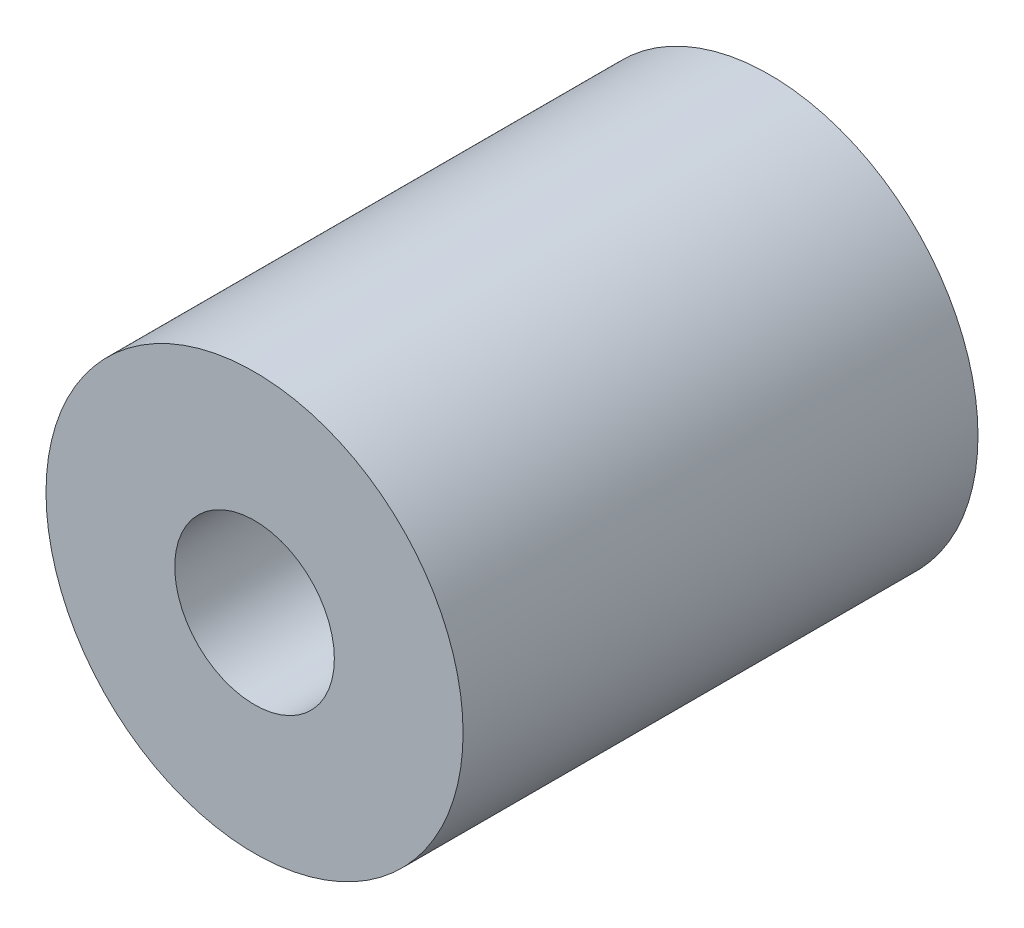
ISO-10303-21;
HEADER;
FILE_DESCRIPTION(('STEP AP214'),'2;1');
FILE_NAME('part.step','',(''),(''),'','','');
FILE_SCHEMA(('AUTOMOTIVE_DESIGN { 1 0 10303 214 1 1 1 1 }'));
ENDSEC;
DATA;
#1=APPLICATION_CONTEXT('core data for automotive mechanical design processes');
#2=APPLICATION_PROTOCOL_DEFINITION('international standard','automotive_design',2000,#1);
#3=PRODUCT_CONTEXT('',#1,'mechanical');
#4=PRODUCT('Part','Part','',(#3));
#5=PRODUCT_RELATED_PRODUCT_CATEGORY('part','',(#4));
#6=PRODUCT_DEFINITION_FORMATION('','',#4);
#7=PRODUCT_DEFINITION_CONTEXT('part definition',#1,'design');
#8=PRODUCT_DEFINITION('design','',#6,#7);
#9=PRODUCT_DEFINITION_SHAPE('','',#8);
#10=(LENGTH_UNIT() NAMED_UNIT(*) SI_UNIT(.MILLI.,.METRE.));
#11=(NAMED_UNIT(*) PLANE_ANGLE_UNIT() SI_UNIT($,.RADIAN.));
#12=(NAMED_UNIT(*) SI_UNIT($,.STERADIAN.) SOLID_ANGLE_UNIT());
#13=UNCERTAINTY_MEASURE_WITH_UNIT(LENGTH_MEASURE(1.E-05),#10,'distance_accuracy_value','');
#14=(GEOMETRIC_REPRESENTATION_CONTEXT(3) GLOBAL_UNCERTAINTY_ASSIGNED_CONTEXT((#13)) GLOBAL_UNIT_ASSIGNED_CONTEXT((#10,
#11,#12)) REPRESENTATION_CONTEXT('',''));
#15=CARTESIAN_POINT('',(0.,0.,0.));
#16=DIRECTION('',(0.,0.,1.));
#17=DIRECTION('',(1.,0.,0.));
#18=AXIS2_PLACEMENT_3D('',#15,#16,#17);
#19=CARTESIAN_POINT('',(0.,0.,10.));
#20=DIRECTION('',(0.,0.,1.));
#21=DIRECTION('',(1.,0.,0.));
#22=AXIS2_PLACEMENT_3D('',#19,#20,#21);
#23=PLANE('',#22);
#24=CARTESIAN_POINT('',(0.,0.,10.));
#25=DIRECTION('',(0.,0.,1.));
#26=DIRECTION('',(1.,0.,0.));
#27=AXIS2_PLACEMENT_3D('',#24,#25,#26);
#28=CIRCLE('',#27,4.05);
#29=CARTESIAN_POINT('',(4.05,0.,10.));
#30=VERTEX_POINT('',#29);
#31=EDGE_CURVE('E11',#30,#30,#28,.T.);
#32=ORIENTED_EDGE('',*,*,#31,.T.);
#33=EDGE_LOOP('',(#32));
#34=FACE_BOUND('',#33,.T.);
#35=CARTESIAN_POINT('',(0.,0.,10.));
#36=DIRECTION('',(0.,0.,1.));
#37=DIRECTION('',(1.,0.,0.));
#38=AXIS2_PLACEMENT_3D('',#35,#36,#37);
#39=CIRCLE('',#38,1.55);
#40=CARTESIAN_POINT('',(1.55,0.,10.));
#41=VERTEX_POINT('',#40);
#42=EDGE_CURVE('E56',#41,#41,#39,.T.);
#43=ORIENTED_EDGE('',*,*,#42,.F.);
#44=EDGE_LOOP('',(#43));
#45=FACE_BOUND('',#44,.T.);
#46=ADVANCED_FACE('F45',(#34,#45),#23,.T.);
#47=CARTESIAN_POINT('',(0.,0.,0.));
#48=DIRECTION('',(0.,0.,1.));
#49=DIRECTION('',(1.,0.,0.));
#50=AXIS2_PLACEMENT_3D('',#47,#48,#49);
#51=PLANE('',#50);
#52=CARTESIAN_POINT('',(0.,0.,0.));
#53=DIRECTION('',(0.,0.,1.));
#54=DIRECTION('',(1.,0.,0.));
#55=AXIS2_PLACEMENT_3D('',#52,#53,#54);
#56=CIRCLE('',#55,4.05);
#57=CARTESIAN_POINT('',(4.05,0.,0.));
#58=VERTEX_POINT('',#57);
#59=EDGE_CURVE('E49',#58,#58,#56,.T.);
#60=ORIENTED_EDGE('',*,*,#59,.F.);
#61=EDGE_LOOP('',(#60));
#62=FACE_BOUND('',#61,.T.);
#63=CARTESIAN_POINT('',(0.,0.,0.));
#64=DIRECTION('',(0.,0.,1.));
#65=DIRECTION('',(1.,0.,0.));
#66=AXIS2_PLACEMENT_3D('',#63,#64,#65);
#67=CIRCLE('',#66,1.55);
#68=CARTESIAN_POINT('',(1.55,0.,0.));
#69=VERTEX_POINT('',#68);
#70=EDGE_CURVE('E58',#69,#69,#67,.T.);
#71=ORIENTED_EDGE('',*,*,#70,.T.);
#72=EDGE_LOOP('',(#71));
#73=FACE_BOUND('',#72,.T.);
#74=ADVANCED_FACE('F68',(#62,#73),#51,.F.);
#75=CARTESIAN_POINT('',(0.,0.,10.));
#76=DIRECTION('',(0.,0.,-1.));
#77=DIRECTION('',(-1.,0.,0.));
#78=AXIS2_PLACEMENT_3D('',#75,#76,#77);
#79=CYLINDRICAL_SURFACE('',#78,4.05);
#80=ORIENTED_EDGE('',*,*,#31,.F.);
#81=EDGE_LOOP('',(#80));
#82=FACE_BOUND('',#81,.T.);
#83=ORIENTED_EDGE('',*,*,#59,.T.);
#84=EDGE_LOOP('',(#83));
#85=FACE_BOUND('',#84,.T.);
#86=ADVANCED_FACE('F47',(#82,#85),#79,.T.);
#87=CARTESIAN_POINT('',(0.,0.,10.));
#88=DIRECTION('',(0.,0.,-1.));
#89=DIRECTION('',(-1.,0.,0.));
#90=AXIS2_PLACEMENT_3D('',#87,#88,#89);
#91=CYLINDRICAL_SURFACE('',#90,1.55);
#92=ORIENTED_EDGE('',*,*,#42,.T.);
#93=EDGE_LOOP('',(#92));
#94=FACE_BOUND('',#93,.T.);
#95=ORIENTED_EDGE('',*,*,#70,.F.);
#96=EDGE_LOOP('',(#95));
#97=FACE_BOUND('',#96,.T.);
#98=ADVANCED_FACE('F64',(#94,#97),#91,.F.);
#99=CLOSED_SHELL('',(#46,#74,#86,#98));
#100=MANIFOLD_SOLID_BREP('B2',#99);
#101=ADVANCED_BREP_SHAPE_REPRESENTATION('',(#18,#100),#14);
#102=SHAPE_DEFINITION_REPRESENTATION(#9,#101);
ENDSEC;
END-ISO-10303-21;
